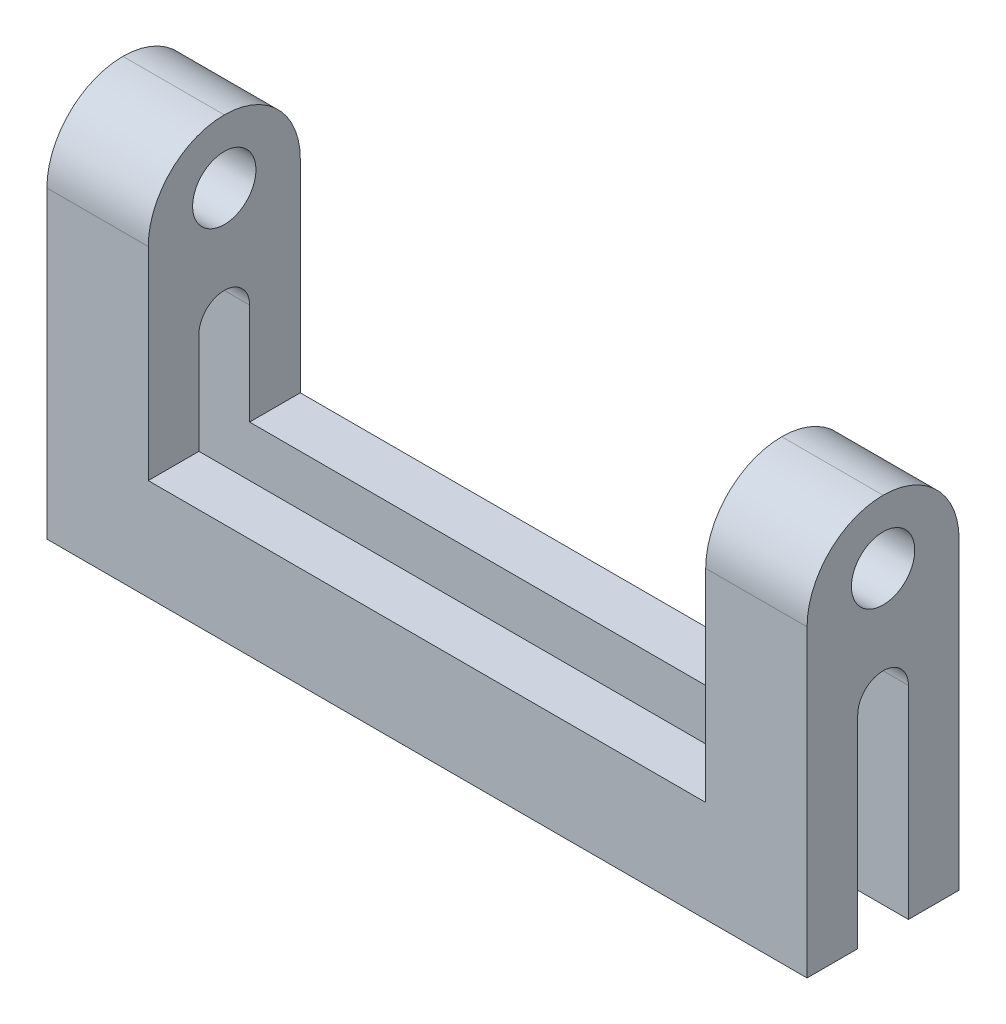
ISO-10303-21;
HEADER;
FILE_DESCRIPTION(('STEP AP214'),'2;1');
FILE_NAME('part.step','',(''),(''),'','','');
FILE_SCHEMA(('AUTOMOTIVE_DESIGN { 1 0 10303 214 1 1 1 1 }'));
ENDSEC;
DATA;
#1=APPLICATION_CONTEXT('core data for automotive mechanical design processes');
#2=APPLICATION_PROTOCOL_DEFINITION('international standard','automotive_design',2000,#1);
#3=PRODUCT_CONTEXT('',#1,'mechanical');
#4=PRODUCT('Part','Part','',(#3));
#5=PRODUCT_RELATED_PRODUCT_CATEGORY('part','',(#4));
#6=PRODUCT_DEFINITION_FORMATION('','',#4);
#7=PRODUCT_DEFINITION_CONTEXT('part definition',#1,'design');
#8=PRODUCT_DEFINITION('design','',#6,#7);
#9=PRODUCT_DEFINITION_SHAPE('','',#8);
#10=(LENGTH_UNIT() NAMED_UNIT(*) SI_UNIT(.MILLI.,.METRE.));
#11=(NAMED_UNIT(*) PLANE_ANGLE_UNIT() SI_UNIT($,.RADIAN.));
#12=(NAMED_UNIT(*) SI_UNIT($,.STERADIAN.) SOLID_ANGLE_UNIT());
#13=UNCERTAINTY_MEASURE_WITH_UNIT(LENGTH_MEASURE(1.E-05),#10,'distance_accuracy_value','');
#14=(GEOMETRIC_REPRESENTATION_CONTEXT(3) GLOBAL_UNCERTAINTY_ASSIGNED_CONTEXT((#13)) GLOBAL_UNIT_ASSIGNED_CONTEXT((#10,
#11,#12)) REPRESENTATION_CONTEXT('',''));
#15=CARTESIAN_POINT('',(0.,0.,0.));
#16=DIRECTION('',(0.,0.,1.));
#17=DIRECTION('',(1.,0.,0.));
#18=AXIS2_PLACEMENT_3D('',#15,#16,#17);
#19=CARTESIAN_POINT('',(0.,8.,0.));
#20=DIRECTION('',(0.,-1.,0.));
#21=DIRECTION('',(0.,0.,-1.));
#22=AXIS2_PLACEMENT_3D('',#19,#20,#21);
#23=PLANE('',#22);
#24=DIRECTION('',(0.,0.,-1.));
#25=VECTOR('',#24,1.);
#26=CARTESIAN_POINT('',(-22.,8.,-6.));
#27=LINE('',#26,#25);
#28=CARTESIAN_POINT('',(-22.,8.,-2.));
#29=VERTEX_POINT('',#28);
#30=CARTESIAN_POINT('',(-22.,8.,-6.));
#31=VERTEX_POINT('',#30);
#32=EDGE_CURVE('E376',#29,#31,#27,.T.);
#33=ORIENTED_EDGE('',*,*,#32,.F.);
#34=DIRECTION('',(1.,0.,0.));
#35=VECTOR('',#34,1.);
#36=CARTESIAN_POINT('',(0.,8.,-2.));
#37=LINE('',#36,#35);
#38=CARTESIAN_POINT('',(22.,8.,-2.));
#39=VERTEX_POINT('',#38);
#40=EDGE_CURVE('E429',#29,#39,#37,.T.);
#41=ORIENTED_EDGE('',*,*,#40,.T.);
#42=DIRECTION('',(0.,0.,1.));
#43=VECTOR('',#42,1.);
#44=CARTESIAN_POINT('',(22.,8.,-6.));
#45=LINE('',#44,#43);
#46=CARTESIAN_POINT('',(22.,8.,-6.));
#47=VERTEX_POINT('',#46);
#48=EDGE_CURVE('E362',#47,#39,#45,.T.);
#49=ORIENTED_EDGE('',*,*,#48,.F.);
#50=DIRECTION('',(-1.,0.,0.));
#51=VECTOR('',#50,1.);
#52=CARTESIAN_POINT('',(-30.,8.,-6.));
#53=LINE('',#52,#51);
#54=EDGE_CURVE('E222',#47,#31,#53,.T.);
#55=ORIENTED_EDGE('',*,*,#54,.T.);
#56=EDGE_LOOP('',(#33,#41,#49,#55));
#57=FACE_BOUND('',#56,.T.);
#58=ADVANCED_FACE('F39',(#57),#23,.F.);
#59=CARTESIAN_POINT('',(0.,0.,0.));
#60=DIRECTION('',(0.,-1.,0.));
#61=DIRECTION('',(0.,0.,-1.));
#62=AXIS2_PLACEMENT_3D('',#59,#60,#61);
#63=PLANE('',#62);
#64=DIRECTION('',(1.,0.,0.));
#65=VECTOR('',#64,1.);
#66=CARTESIAN_POINT('',(-30.,0.,-2.));
#67=LINE('',#66,#65);
#68=CARTESIAN_POINT('',(-30.,0.,-2.));
#69=VERTEX_POINT('',#68);
#70=CARTESIAN_POINT('',(30.,0.,-2.));
#71=VERTEX_POINT('',#70);
#72=EDGE_CURVE('E202',#69,#71,#67,.T.);
#73=ORIENTED_EDGE('',*,*,#72,.F.);
#74=DIRECTION('',(0.,0.,1.));
#75=VECTOR('',#74,1.);
#76=CARTESIAN_POINT('',(-30.,0.,6.));
#77=LINE('',#76,#75);
#78=CARTESIAN_POINT('',(-30.,0.,-6.));
#79=VERTEX_POINT('',#78);
#80=EDGE_CURVE('E210',#79,#69,#77,.T.);
#81=ORIENTED_EDGE('',*,*,#80,.F.);
#82=DIRECTION('',(-1.,0.,0.));
#83=VECTOR('',#82,1.);
#84=CARTESIAN_POINT('',(-30.,0.,-6.));
#85=LINE('',#84,#83);
#86=CARTESIAN_POINT('',(30.,0.,-6.));
#87=VERTEX_POINT('',#86);
#88=EDGE_CURVE('E211',#87,#79,#85,.T.);
#89=ORIENTED_EDGE('',*,*,#88,.F.);
#90=DIRECTION('',(0.,0.,-1.));
#91=VECTOR('',#90,1.);
#92=CARTESIAN_POINT('',(30.,0.,6.));
#93=LINE('',#92,#91);
#94=EDGE_CURVE('E387',#71,#87,#93,.T.);
#95=ORIENTED_EDGE('',*,*,#94,.F.);
#96=EDGE_LOOP('',(#73,#81,#89,#95));
#97=FACE_BOUND('',#96,.T.);
#98=ADVANCED_FACE('F409',(#97),#63,.T.);
#99=CARTESIAN_POINT('',(22.,8.,2.));
#100=VERTEX_POINT('',#99);
#101=CARTESIAN_POINT('',(22.,8.,6.));
#102=VERTEX_POINT('',#101);
#103=EDGE_CURVE('E356',#100,#102,#45,.T.);
#104=ORIENTED_EDGE('',*,*,#103,.F.);
#105=DIRECTION('',(-1.,0.,0.));
#106=VECTOR('',#105,1.);
#107=CARTESIAN_POINT('',(0.,8.,2.));
#108=LINE('',#107,#106);
#109=CARTESIAN_POINT('',(-22.,8.,2.));
#110=VERTEX_POINT('',#109);
#111=EDGE_CURVE('E345',#100,#110,#108,.T.);
#112=ORIENTED_EDGE('',*,*,#111,.T.);
#113=CARTESIAN_POINT('',(-22.,8.,6.));
#114=VERTEX_POINT('',#113);
#115=EDGE_CURVE('E377',#114,#110,#27,.T.);
#116=ORIENTED_EDGE('',*,*,#115,.F.);
#117=DIRECTION('',(1.,0.,0.));
#118=VECTOR('',#117,1.);
#119=CARTESIAN_POINT('',(-30.,8.,6.));
#120=LINE('',#119,#118);
#121=EDGE_CURVE('E227',#114,#102,#120,.T.);
#122=ORIENTED_EDGE('',*,*,#121,.T.);
#123=EDGE_LOOP('',(#104,#112,#116,#122));
#124=FACE_BOUND('',#123,.T.);
#125=ADVANCED_FACE('F357',(#124),#23,.F.);
#126=CARTESIAN_POINT('',(30.,8.,6.));
#127=DIRECTION('',(-1.,0.,0.));
#128=DIRECTION('',(0.,0.,1.));
#129=AXIS2_PLACEMENT_3D('',#126,#127,#128);
#130=PLANE('',#129);
#131=CARTESIAN_POINT('',(30.,25.,0.));
#132=DIRECTION('',(-1.,0.,0.));
#133=DIRECTION('',(0.,0.,1.));
#134=AXIS2_PLACEMENT_3D('',#131,#132,#133);
#135=CIRCLE('',#134,2.5);
#136=CARTESIAN_POINT('',(30.,25.,2.5));
#137=VERTEX_POINT('',#136);
#138=EDGE_CURVE('E243',#137,#137,#135,.T.);
#139=ORIENTED_EDGE('',*,*,#138,.T.);
#140=EDGE_LOOP('',(#139));
#141=FACE_BOUND('',#140,.T.);
#142=DIRECTION('',(0.,-1.,0.));
#143=VECTOR('',#142,1.);
#144=CARTESIAN_POINT('',(30.,18.,2.));
#145=LINE('',#144,#143);
#146=CARTESIAN_POINT('',(30.,16.,2.));
#147=VERTEX_POINT('',#146);
#148=CARTESIAN_POINT('',(30.,0.,2.));
#149=VERTEX_POINT('',#148);
#150=EDGE_CURVE('E193',#147,#149,#145,.T.);
#151=ORIENTED_EDGE('',*,*,#150,.F.);
#152=CARTESIAN_POINT('',(30.,16.,0.));
#153=DIRECTION('',(-1.,0.,0.));
#154=DIRECTION('',(0.,0.,1.));
#155=AXIS2_PLACEMENT_3D('',#152,#153,#154);
#156=CIRCLE('',#155,2.);
#157=CARTESIAN_POINT('',(30.,18.,0.));
#158=VERTEX_POINT('',#157);
#159=EDGE_CURVE('E11',#147,#158,#156,.T.);
#160=ORIENTED_EDGE('',*,*,#159,.T.);
#161=CARTESIAN_POINT('',(30.,16.,0.));
#162=DIRECTION('',(-1.,0.,0.));
#163=DIRECTION('',(0.,0.,1.));
#164=AXIS2_PLACEMENT_3D('',#161,#162,#163);
#165=CIRCLE('',#164,2.);
#166=CARTESIAN_POINT('',(30.,16.,-2.));
#167=VERTEX_POINT('',#166);
#168=EDGE_CURVE('E321',#158,#167,#165,.T.);
#169=ORIENTED_EDGE('',*,*,#168,.T.);
#170=DIRECTION('',(0.,-1.,0.));
#171=VECTOR('',#170,1.);
#172=CARTESIAN_POINT('',(30.,18.,-2.));
#173=LINE('',#172,#171);
#174=EDGE_CURVE('E353',#167,#71,#173,.T.);
#175=ORIENTED_EDGE('',*,*,#174,.T.);
#176=ORIENTED_EDGE('',*,*,#94,.T.);
#177=DIRECTION('',(0.,-1.,0.));
#178=VECTOR('',#177,1.);
#179=CARTESIAN_POINT('',(30.,8.,-6.));
#180=LINE('',#179,#178);
#181=CARTESIAN_POINT('',(30.,24.,-6.));
#182=VERTEX_POINT('',#181);
#183=EDGE_CURVE('E233',#182,#87,#180,.T.);
#184=ORIENTED_EDGE('',*,*,#183,.F.);
#185=CARTESIAN_POINT('',(30.,24.,0.));
#186=DIRECTION('',(-1.,0.,0.));
#187=DIRECTION('',(0.,0.,1.));
#188=AXIS2_PLACEMENT_3D('',#185,#186,#187);
#189=CIRCLE('',#188,6.);
#190=CARTESIAN_POINT('',(30.,30.,0.));
#191=VERTEX_POINT('',#190);
#192=EDGE_CURVE('E263',#182,#191,#189,.F.);
#193=ORIENTED_EDGE('',*,*,#192,.T.);
#194=CARTESIAN_POINT('',(30.,24.,0.));
#195=DIRECTION('',(-1.,0.,0.));
#196=DIRECTION('',(0.,0.,1.));
#197=AXIS2_PLACEMENT_3D('',#194,#195,#196);
#198=CIRCLE('',#197,6.);
#199=CARTESIAN_POINT('',(30.,24.,6.));
#200=VERTEX_POINT('',#199);
#201=EDGE_CURVE('E266',#191,#200,#198,.F.);
#202=ORIENTED_EDGE('',*,*,#201,.T.);
#203=DIRECTION('',(0.,-1.,0.));
#204=VECTOR('',#203,1.);
#205=CARTESIAN_POINT('',(30.,8.,6.));
#206=LINE('',#205,#204);
#207=CARTESIAN_POINT('',(30.,0.,6.));
#208=VERTEX_POINT('',#207);
#209=EDGE_CURVE('E223',#200,#208,#206,.T.);
#210=ORIENTED_EDGE('',*,*,#209,.T.);
#211=EDGE_CURVE('E216',#208,#149,#93,.T.);
#212=ORIENTED_EDGE('',*,*,#211,.T.);
#213=EDGE_LOOP('',(#151,#160,#169,#175,#176,#184,#193,#202,#210,#212));
#214=FACE_BOUND('',#213,.T.);
#215=ADVANCED_FACE('F396',(#141,#214),#130,.F.);
#216=CARTESIAN_POINT('',(-30.,8.,-6.));
#217=DIRECTION('',(0.,0.,1.));
#218=DIRECTION('',(1.,0.,0.));
#219=AXIS2_PLACEMENT_3D('',#216,#217,#218);
#220=PLANE('',#219);
#221=DIRECTION('',(0.,-1.,0.));
#222=VECTOR('',#221,1.);
#223=CARTESIAN_POINT('',(22.,30.,-6.));
#224=LINE('',#223,#222);
#225=CARTESIAN_POINT('',(22.,24.,-6.));
#226=VERTEX_POINT('',#225);
#227=EDGE_CURVE('E373',#226,#47,#224,.T.);
#228=ORIENTED_EDGE('',*,*,#227,.F.);
#229=DIRECTION('',(-1.,0.,0.));
#230=VECTOR('',#229,1.);
#231=CARTESIAN_POINT('',(-30.,24.,-6.));
#232=LINE('',#231,#230);
#233=EDGE_CURVE('E278',#226,#182,#232,.F.);
#234=ORIENTED_EDGE('',*,*,#233,.T.);
#235=ORIENTED_EDGE('',*,*,#183,.T.);
#236=ORIENTED_EDGE('',*,*,#88,.T.);
#237=DIRECTION('',(0.,-1.,0.));
#238=VECTOR('',#237,1.);
#239=CARTESIAN_POINT('',(-30.,8.,-6.));
#240=LINE('',#239,#238);
#241=CARTESIAN_POINT('',(-30.,24.,-6.));
#242=VERTEX_POINT('',#241);
#243=EDGE_CURVE('E230',#242,#79,#240,.T.);
#244=ORIENTED_EDGE('',*,*,#243,.F.);
#245=DIRECTION('',(-1.,0.,0.));
#246=VECTOR('',#245,1.);
#247=CARTESIAN_POINT('',(-22.,24.,-6.));
#248=LINE('',#247,#246);
#249=CARTESIAN_POINT('',(-22.,24.,-6.));
#250=VERTEX_POINT('',#249);
#251=EDGE_CURVE('E275',#242,#250,#248,.F.);
#252=ORIENTED_EDGE('',*,*,#251,.T.);
#253=DIRECTION('',(0.,-1.,0.));
#254=VECTOR('',#253,1.);
#255=CARTESIAN_POINT('',(-22.,30.,-6.));
#256=LINE('',#255,#254);
#257=EDGE_CURVE('E380',#250,#31,#256,.T.);
#258=ORIENTED_EDGE('',*,*,#257,.T.);
#259=ORIENTED_EDGE('',*,*,#54,.F.);
#260=EDGE_LOOP('',(#228,#234,#235,#236,#244,#252,#258,#259));
#261=FACE_BOUND('',#260,.T.);
#262=ADVANCED_FACE('F405',(#261),#220,.F.);
#263=CARTESIAN_POINT('',(-30.,8.,6.));
#264=DIRECTION('',(1.,0.,0.));
#265=DIRECTION('',(0.,0.,-1.));
#266=AXIS2_PLACEMENT_3D('',#263,#264,#265);
#267=PLANE('',#266);
#268=ORIENTED_EDGE('',*,*,#80,.T.);
#269=DIRECTION('',(0.,-1.,0.));
#270=VECTOR('',#269,1.);
#271=CARTESIAN_POINT('',(-30.,18.,-2.));
#272=LINE('',#271,#270);
#273=CARTESIAN_POINT('',(-30.,16.,-2.));
#274=VERTEX_POINT('',#273);
#275=EDGE_CURVE('E192',#274,#69,#272,.T.);
#276=ORIENTED_EDGE('',*,*,#275,.F.);
#277=CARTESIAN_POINT('',(-30.,16.,0.));
#278=DIRECTION('',(1.,0.,0.));
#279=DIRECTION('',(0.,0.,-1.));
#280=AXIS2_PLACEMENT_3D('',#277,#278,#279);
#281=CIRCLE('',#280,2.);
#282=CARTESIAN_POINT('',(-30.,18.,0.));
#283=VERTEX_POINT('',#282);
#284=EDGE_CURVE('E318',#274,#283,#281,.T.);
#285=ORIENTED_EDGE('',*,*,#284,.T.);
#286=CARTESIAN_POINT('',(-30.,16.,0.));
#287=DIRECTION('',(1.,0.,0.));
#288=DIRECTION('',(0.,0.,-1.));
#289=AXIS2_PLACEMENT_3D('',#286,#287,#288);
#290=CIRCLE('',#289,2.);
#291=CARTESIAN_POINT('',(-30.,16.,2.));
#292=VERTEX_POINT('',#291);
#293=EDGE_CURVE('E187',#283,#292,#290,.T.);
#294=ORIENTED_EDGE('',*,*,#293,.T.);
#295=DIRECTION('',(0.,-1.,0.));
#296=VECTOR('',#295,1.);
#297=CARTESIAN_POINT('',(-30.,18.,2.));
#298=LINE('',#297,#296);
#299=CARTESIAN_POINT('',(-30.,0.,2.));
#300=VERTEX_POINT('',#299);
#301=EDGE_CURVE('E177',#292,#300,#298,.T.);
#302=ORIENTED_EDGE('',*,*,#301,.T.);
#303=CARTESIAN_POINT('',(-30.,0.,6.));
#304=VERTEX_POINT('',#303);
#305=EDGE_CURVE('E184',#300,#304,#77,.T.);
#306=ORIENTED_EDGE('',*,*,#305,.T.);
#307=DIRECTION('',(0.,-1.,0.));
#308=VECTOR('',#307,1.);
#309=CARTESIAN_POINT('',(-30.,8.,6.));
#310=LINE('',#309,#308);
#311=CARTESIAN_POINT('',(-30.,24.,6.));
#312=VERTEX_POINT('',#311);
#313=EDGE_CURVE('E226',#312,#304,#310,.T.);
#314=ORIENTED_EDGE('',*,*,#313,.F.);
#315=CARTESIAN_POINT('',(-30.,24.,0.));
#316=DIRECTION('',(1.,0.,0.));
#317=DIRECTION('',(0.,0.,-1.));
#318=AXIS2_PLACEMENT_3D('',#315,#316,#317);
#319=CIRCLE('',#318,6.);
#320=CARTESIAN_POINT('',(-30.,30.,0.));
#321=VERTEX_POINT('',#320);
#322=EDGE_CURVE('E260',#312,#321,#319,.F.);
#323=ORIENTED_EDGE('',*,*,#322,.T.);
#324=CARTESIAN_POINT('',(-30.,24.,0.));
#325=DIRECTION('',(1.,0.,0.));
#326=DIRECTION('',(0.,0.,-1.));
#327=AXIS2_PLACEMENT_3D('',#324,#325,#326);
#328=CIRCLE('',#327,6.);
#329=EDGE_CURVE('E257',#321,#242,#328,.F.);
#330=ORIENTED_EDGE('',*,*,#329,.T.);
#331=ORIENTED_EDGE('',*,*,#243,.T.);
#332=EDGE_LOOP('',(#268,#276,#285,#294,#302,#306,#314,#323,#330,#331));
#333=FACE_BOUND('',#332,.T.);
#334=CARTESIAN_POINT('',(-30.,25.,0.));
#335=DIRECTION('',(-1.,0.,0.));
#336=DIRECTION('',(0.,0.,1.));
#337=AXIS2_PLACEMENT_3D('',#334,#335,#336);
#338=CIRCLE('',#337,2.5);
#339=CARTESIAN_POINT('',(-30.,25.,2.5));
#340=VERTEX_POINT('',#339);
#341=EDGE_CURVE('E286',#340,#340,#338,.T.);
#342=ORIENTED_EDGE('',*,*,#341,.F.);
#343=EDGE_LOOP('',(#342));
#344=FACE_BOUND('',#343,.T.);
#345=ADVANCED_FACE('F180',(#333,#344),#267,.F.);
#346=CARTESIAN_POINT('',(-30.,8.,6.));
#347=DIRECTION('',(0.,0.,-1.));
#348=DIRECTION('',(-1.,0.,0.));
#349=AXIS2_PLACEMENT_3D('',#346,#347,#348);
#350=PLANE('',#349);
#351=DIRECTION('',(0.,-1.,0.));
#352=VECTOR('',#351,1.);
#353=CARTESIAN_POINT('',(-22.,30.,6.));
#354=LINE('',#353,#352);
#355=CARTESIAN_POINT('',(-22.,24.,6.));
#356=VERTEX_POINT('',#355);
#357=EDGE_CURVE('E384',#356,#114,#354,.T.);
#358=ORIENTED_EDGE('',*,*,#357,.F.);
#359=DIRECTION('',(1.,0.,0.));
#360=VECTOR('',#359,1.);
#361=CARTESIAN_POINT('',(-30.,24.,6.));
#362=LINE('',#361,#360);
#363=EDGE_CURVE('E253',#356,#312,#362,.F.);
#364=ORIENTED_EDGE('',*,*,#363,.T.);
#365=ORIENTED_EDGE('',*,*,#313,.T.);
#366=DIRECTION('',(1.,0.,0.));
#367=VECTOR('',#366,1.);
#368=CARTESIAN_POINT('',(-30.,0.,6.));
#369=LINE('',#368,#367);
#370=EDGE_CURVE('E208',#304,#208,#369,.T.);
#371=ORIENTED_EDGE('',*,*,#370,.T.);
#372=ORIENTED_EDGE('',*,*,#209,.F.);
#373=DIRECTION('',(1.,0.,0.));
#374=VECTOR('',#373,1.);
#375=CARTESIAN_POINT('',(-30.,24.,6.));
#376=LINE('',#375,#374);
#377=CARTESIAN_POINT('',(22.,24.,6.));
#378=VERTEX_POINT('',#377);
#379=EDGE_CURVE('E249',#200,#378,#376,.F.);
#380=ORIENTED_EDGE('',*,*,#379,.T.);
#381=DIRECTION('',(0.,-1.,0.));
#382=VECTOR('',#381,1.);
#383=CARTESIAN_POINT('',(22.,30.,6.));
#384=LINE('',#383,#382);
#385=EDGE_CURVE('E366',#378,#102,#384,.T.);
#386=ORIENTED_EDGE('',*,*,#385,.T.);
#387=ORIENTED_EDGE('',*,*,#121,.F.);
#388=EDGE_LOOP('',(#358,#364,#365,#371,#372,#380,#386,#387));
#389=FACE_BOUND('',#388,.T.);
#390=ADVANCED_FACE('F439',(#389),#350,.F.);
#391=DIRECTION('',(-1.,0.,0.));
#392=VECTOR('',#391,1.);
#393=CARTESIAN_POINT('',(-30.,0.,2.));
#394=LINE('',#393,#392);
#395=EDGE_CURVE('E196',#149,#300,#394,.T.);
#396=ORIENTED_EDGE('',*,*,#395,.F.);
#397=ORIENTED_EDGE('',*,*,#211,.F.);
#398=ORIENTED_EDGE('',*,*,#370,.F.);
#399=ORIENTED_EDGE('',*,*,#305,.F.);
#400=EDGE_LOOP('',(#396,#397,#398,#399));
#401=FACE_BOUND('',#400,.T.);
#402=ADVANCED_FACE('F206',(#401),#63,.T.);
#403=CARTESIAN_POINT('',(-22.,30.,-6.));
#404=DIRECTION('',(-1.,0.,0.));
#405=DIRECTION('',(0.,0.,1.));
#406=AXIS2_PLACEMENT_3D('',#403,#404,#405);
#407=PLANE('',#406);
#408=CARTESIAN_POINT('',(-22.,25.,0.));
#409=DIRECTION('',(-1.,0.,0.));
#410=DIRECTION('',(0.,0.,1.));
#411=AXIS2_PLACEMENT_3D('',#408,#409,#410);
#412=CIRCLE('',#411,2.5);
#413=CARTESIAN_POINT('',(-22.,25.,2.5));
#414=VERTEX_POINT('',#413);
#415=EDGE_CURVE('E242',#414,#414,#412,.T.);
#416=ORIENTED_EDGE('',*,*,#415,.T.);
#417=EDGE_LOOP('',(#416));
#418=FACE_BOUND('',#417,.T.);
#419=CARTESIAN_POINT('',(-22.,16.,0.));
#420=DIRECTION('',(-1.,0.,0.));
#421=DIRECTION('',(0.,0.,1.));
#422=AXIS2_PLACEMENT_3D('',#419,#420,#421);
#423=CIRCLE('',#422,2.);
#424=CARTESIAN_POINT('',(-22.,16.,2.));
#425=VERTEX_POINT('',#424);
#426=CARTESIAN_POINT('',(-22.,18.,0.));
#427=VERTEX_POINT('',#426);
#428=EDGE_CURVE('E312',#425,#427,#423,.T.);
#429=ORIENTED_EDGE('',*,*,#428,.T.);
#430=CARTESIAN_POINT('',(-22.,16.,0.));
#431=DIRECTION('',(-1.,0.,0.));
#432=DIRECTION('',(0.,0.,1.));
#433=AXIS2_PLACEMENT_3D('',#430,#431,#432);
#434=CIRCLE('',#433,2.);
#435=CARTESIAN_POINT('',(-22.,16.,-2.));
#436=VERTEX_POINT('',#435);
#437=EDGE_CURVE('E315',#427,#436,#434,.T.);
#438=ORIENTED_EDGE('',*,*,#437,.T.);
#439=DIRECTION('',(0.,-1.,0.));
#440=VECTOR('',#439,1.);
#441=CARTESIAN_POINT('',(-22.,30.,-2.));
#442=LINE('',#441,#440);
#443=EDGE_CURVE('E291',#436,#29,#442,.T.);
#444=ORIENTED_EDGE('',*,*,#443,.T.);
#445=ORIENTED_EDGE('',*,*,#32,.T.);
#446=ORIENTED_EDGE('',*,*,#257,.F.);
#447=CARTESIAN_POINT('',(-22.,24.,0.));
#448=DIRECTION('',(-1.,0.,0.));
#449=DIRECTION('',(0.,0.,1.));
#450=AXIS2_PLACEMENT_3D('',#447,#448,#449);
#451=CIRCLE('',#450,6.);
#452=CARTESIAN_POINT('',(-22.,30.,0.));
#453=VERTEX_POINT('',#452);
#454=EDGE_CURVE('E237',#250,#453,#451,.F.);
#455=ORIENTED_EDGE('',*,*,#454,.T.);
#456=CARTESIAN_POINT('',(-22.,24.,0.));
#457=DIRECTION('',(-1.,0.,0.));
#458=DIRECTION('',(0.,0.,1.));
#459=AXIS2_PLACEMENT_3D('',#456,#457,#458);
#460=CIRCLE('',#459,6.);
#461=EDGE_CURVE('E246',#453,#356,#460,.F.);
#462=ORIENTED_EDGE('',*,*,#461,.T.);
#463=ORIENTED_EDGE('',*,*,#357,.T.);
#464=ORIENTED_EDGE('',*,*,#115,.T.);
#465=DIRECTION('',(0.,1.,0.));
#466=VECTOR('',#465,1.);
#467=CARTESIAN_POINT('',(-22.,30.,2.));
#468=LINE('',#467,#466);
#469=EDGE_CURVE('E348',#110,#425,#468,.T.);
#470=ORIENTED_EDGE('',*,*,#469,.T.);
#471=EDGE_LOOP('',(#429,#438,#444,#445,#446,#455,#462,#463,#464,#470));
#472=FACE_BOUND('',#471,.T.);
#473=ADVANCED_FACE('F421',(#418,#472),#407,.F.);
#474=CARTESIAN_POINT('',(22.,30.,-6.));
#475=DIRECTION('',(1.,0.,0.));
#476=DIRECTION('',(0.,0.,-1.));
#477=AXIS2_PLACEMENT_3D('',#474,#475,#476);
#478=PLANE('',#477);
#479=ORIENTED_EDGE('',*,*,#48,.T.);
#480=DIRECTION('',(0.,1.,0.));
#481=VECTOR('',#480,1.);
#482=CARTESIAN_POINT('',(22.,30.,-2.));
#483=LINE('',#482,#481);
#484=CARTESIAN_POINT('',(22.,16.,-2.));
#485=VERTEX_POINT('',#484);
#486=EDGE_CURVE('E294',#39,#485,#483,.T.);
#487=ORIENTED_EDGE('',*,*,#486,.T.);
#488=CARTESIAN_POINT('',(22.,16.,0.));
#489=DIRECTION('',(1.,0.,0.));
#490=DIRECTION('',(0.,0.,-1.));
#491=AXIS2_PLACEMENT_3D('',#488,#489,#490);
#492=CIRCLE('',#491,2.);
#493=CARTESIAN_POINT('',(22.,18.,0.));
#494=VERTEX_POINT('',#493);
#495=EDGE_CURVE('E57',#485,#494,#492,.T.);
#496=ORIENTED_EDGE('',*,*,#495,.T.);
#497=CARTESIAN_POINT('',(22.,16.,0.));
#498=DIRECTION('',(1.,0.,0.));
#499=DIRECTION('',(0.,0.,-1.));
#500=AXIS2_PLACEMENT_3D('',#497,#498,#499);
#501=CIRCLE('',#500,2.);
#502=CARTESIAN_POINT('',(22.,16.,2.));
#503=VERTEX_POINT('',#502);
#504=EDGE_CURVE('E49',#494,#503,#501,.T.);
#505=ORIENTED_EDGE('',*,*,#504,.T.);
#506=DIRECTION('',(0.,-1.,0.));
#507=VECTOR('',#506,1.);
#508=CARTESIAN_POINT('',(22.,30.,2.));
#509=LINE('',#508,#507);
#510=EDGE_CURVE('E281',#503,#100,#509,.T.);
#511=ORIENTED_EDGE('',*,*,#510,.T.);
#512=ORIENTED_EDGE('',*,*,#103,.T.);
#513=ORIENTED_EDGE('',*,*,#385,.F.);
#514=CARTESIAN_POINT('',(22.,24.,0.));
#515=DIRECTION('',(1.,0.,0.));
#516=DIRECTION('',(0.,0.,-1.));
#517=AXIS2_PLACEMENT_3D('',#514,#515,#516);
#518=CIRCLE('',#517,6.);
#519=CARTESIAN_POINT('',(22.,30.,0.));
#520=VERTEX_POINT('',#519);
#521=EDGE_CURVE('E272',#378,#520,#518,.F.);
#522=ORIENTED_EDGE('',*,*,#521,.T.);
#523=CARTESIAN_POINT('',(22.,24.,0.));
#524=DIRECTION('',(1.,0.,0.));
#525=DIRECTION('',(0.,0.,-1.));
#526=AXIS2_PLACEMENT_3D('',#523,#524,#525);
#527=CIRCLE('',#526,6.);
#528=EDGE_CURVE('E269',#520,#226,#527,.F.);
#529=ORIENTED_EDGE('',*,*,#528,.T.);
#530=ORIENTED_EDGE('',*,*,#227,.T.);
#531=EDGE_LOOP('',(#479,#487,#496,#505,#511,#512,#513,#522,#529,#530));
#532=FACE_BOUND('',#531,.T.);
#533=CARTESIAN_POINT('',(22.,25.,0.));
#534=DIRECTION('',(1.,0.,0.));
#535=DIRECTION('',(0.,0.,-1.));
#536=AXIS2_PLACEMENT_3D('',#533,#534,#535);
#537=CIRCLE('',#536,2.5);
#538=CARTESIAN_POINT('',(22.,25.,2.5));
#539=VERTEX_POINT('',#538);
#540=EDGE_CURVE('E238',#539,#539,#537,.T.);
#541=ORIENTED_EDGE('',*,*,#540,.T.);
#542=EDGE_LOOP('',(#541));
#543=FACE_BOUND('',#542,.T.);
#544=ADVANCED_FACE('F341',(#532,#543),#478,.F.);
#545=CARTESIAN_POINT('',(30.,25.,0.));
#546=DIRECTION('',(-1.,0.,0.));
#547=DIRECTION('',(0.,0.,1.));
#548=AXIS2_PLACEMENT_3D('',#545,#546,#547);
#549=CYLINDRICAL_SURFACE('',#548,2.5);
#550=CARTESIAN_POINT('',(30.,25.,2.5));
#551=CARTESIAN_POINT('',(29.9166666666667,25.,2.5));
#552=CARTESIAN_POINT('',(29.8333333333333,25.,2.5));
#553=CARTESIAN_POINT('',(29.6666666666667,25.,2.5));
#554=CARTESIAN_POINT('',(29.5833333333333,25.,2.5));
#555=CARTESIAN_POINT('',(29.4166666666667,25.,2.5));
#556=CARTESIAN_POINT('',(29.3333333333333,25.,2.5));
#557=CARTESIAN_POINT('',(29.1666666666667,25.,2.5));
#558=CARTESIAN_POINT('',(29.0833333333333,25.,2.5));
#559=CARTESIAN_POINT('',(28.9166666666667,25.,2.5));
#560=CARTESIAN_POINT('',(28.8333333333333,25.,2.5));
#561=CARTESIAN_POINT('',(28.6666666666667,25.,2.5));
#562=CARTESIAN_POINT('',(28.5833333333333,25.,2.5));
#563=CARTESIAN_POINT('',(28.4166666666667,25.,2.5));
#564=CARTESIAN_POINT('',(28.3333333333333,25.,2.5));
#565=CARTESIAN_POINT('',(28.1666666666667,25.,2.5));
#566=CARTESIAN_POINT('',(28.0833333333333,25.,2.5));
#567=CARTESIAN_POINT('',(27.9166666666667,25.,2.5));
#568=CARTESIAN_POINT('',(27.8333333333333,25.,2.5));
#569=CARTESIAN_POINT('',(27.6666666666667,25.,2.5));
#570=CARTESIAN_POINT('',(27.5833333333333,25.,2.5));
#571=CARTESIAN_POINT('',(27.4166666666667,25.,2.5));
#572=CARTESIAN_POINT('',(27.3333333333333,25.,2.5));
#573=CARTESIAN_POINT('',(27.1666666666667,25.,2.5));
#574=CARTESIAN_POINT('',(27.0833333333333,25.,2.5));
#575=CARTESIAN_POINT('',(26.9166666666667,25.,2.5));
#576=CARTESIAN_POINT('',(26.8333333333333,25.,2.5));
#577=CARTESIAN_POINT('',(26.6666666666667,25.,2.5));
#578=CARTESIAN_POINT('',(26.5833333333333,25.,2.5));
#579=CARTESIAN_POINT('',(26.4166666666667,25.,2.5));
#580=CARTESIAN_POINT('',(26.3333333333333,25.,2.5));
#581=CARTESIAN_POINT('',(26.1666666666667,25.,2.5));
#582=CARTESIAN_POINT('',(26.0833333333333,25.,2.5));
#583=CARTESIAN_POINT('',(25.9166666666667,25.,2.5));
#584=CARTESIAN_POINT('',(25.8333333333333,25.,2.5));
#585=CARTESIAN_POINT('',(25.6666666666667,25.,2.5));
#586=CARTESIAN_POINT('',(25.5833333333333,25.,2.5));
#587=CARTESIAN_POINT('',(25.4166666666667,25.,2.5));
#588=CARTESIAN_POINT('',(25.3333333333333,25.,2.5));
#589=CARTESIAN_POINT('',(25.1666666666667,25.,2.5));
#590=CARTESIAN_POINT('',(25.0833333333333,25.,2.5));
#591=CARTESIAN_POINT('',(24.9166666666667,25.,2.5));
#592=CARTESIAN_POINT('',(24.8333333333333,25.,2.5));
#593=CARTESIAN_POINT('',(24.6666666666667,25.,2.5));
#594=CARTESIAN_POINT('',(24.5833333333333,25.,2.5));
#595=CARTESIAN_POINT('',(24.4166666666667,25.,2.5));
#596=CARTESIAN_POINT('',(24.3333333333333,25.,2.5));
#597=CARTESIAN_POINT('',(24.1666666666667,25.,2.5));
#598=CARTESIAN_POINT('',(24.0833333333333,25.,2.5));
#599=CARTESIAN_POINT('',(23.9166666666667,25.,2.5));
#600=CARTESIAN_POINT('',(23.8333333333333,25.,2.5));
#601=CARTESIAN_POINT('',(23.6666666666667,25.,2.5));
#602=CARTESIAN_POINT('',(23.5833333333333,25.,2.5));
#603=CARTESIAN_POINT('',(23.4166666666667,25.,2.5));
#604=CARTESIAN_POINT('',(23.3333333333333,25.,2.5));
#605=CARTESIAN_POINT('',(23.1666666666667,25.,2.5));
#606=CARTESIAN_POINT('',(23.0833333333333,25.,2.5));
#607=CARTESIAN_POINT('',(22.9166666666667,25.,2.5));
#608=CARTESIAN_POINT('',(22.8333333333333,25.,2.5));
#609=CARTESIAN_POINT('',(22.6666666666667,25.,2.5));
#610=CARTESIAN_POINT('',(22.5833333333333,25.,2.5));
#611=CARTESIAN_POINT('',(22.4166666666667,25.,2.5));
#612=CARTESIAN_POINT('',(22.3333333333333,25.,2.5));
#613=CARTESIAN_POINT('',(22.1666666666667,25.,2.5));
#614=CARTESIAN_POINT('',(22.0833333333333,25.,2.5));
#615=CARTESIAN_POINT('',(22.,25.,2.5));
#616=B_SPLINE_CURVE_WITH_KNOTS('',3,(#550,#551,#552,#553,#554,#555,#556,#557,#558,#559,#560,
#561,#562,#563,#564,#565,#566,#567,#568,#569,#570,#571,#572,#573,#574,#575,#576,#577,#578,#579,
#580,#581,#582,#583,#584,#585,#586,#587,#588,#589,#590,#591,#592,#593,#594,#595,#596,#597,#598,
#599,#600,#601,#602,#603,#604,#605,#606,#607,#608,#609,#610,#611,#612,#613,#614,#615),
.UNSPECIFIED.,.F.,.F.,(4,2,2,2,2,2,2,2,2,2,2,2,2,2,2,2,2,2,2,2,2,2,2,2,2,2,2,2,2,2,2,2,4),(0.,
0.249999999999997,0.499999999999997,0.749999999999997,0.999999999999997,1.25,1.5,1.75,2.,2.25,
2.5,2.75,3.,3.25,3.5,3.75,4.,4.25,4.5,4.75,5.,5.25,5.5,5.75,6.,6.25,6.5,6.75,7.,7.25,7.5,7.75,
8.),.UNSPECIFIED.);
#617=EDGE_CURVE('BSEAM483',#137,#539,#616,.T.);
#618=ORIENTED_EDGE('',*,*,#138,.F.);
#619=ORIENTED_EDGE('',*,*,#540,.F.);
#620=ORIENTED_EDGE('',*,*,#617,.T.);
#621=ORIENTED_EDGE('',*,*,#617,.F.);
#622=EDGE_LOOP('',(#618,#620,#619,#621));
#623=FACE_BOUND('',#622,.T.);
#624=ADVANCED_FACE('F483',(#623),#549,.F.);
#625=CARTESIAN_POINT('',(-30.,25.,2.5));
#626=CARTESIAN_POINT('',(-29.9166666666667,25.,2.5));
#627=CARTESIAN_POINT('',(-29.8333333333333,25.,2.5));
#628=CARTESIAN_POINT('',(-29.6666666666667,25.,2.5));
#629=CARTESIAN_POINT('',(-29.5833333333333,25.,2.5));
#630=CARTESIAN_POINT('',(-29.4166666666667,25.,2.5));
#631=CARTESIAN_POINT('',(-29.3333333333333,25.,2.5));
#632=CARTESIAN_POINT('',(-29.1666666666667,25.,2.5));
#633=CARTESIAN_POINT('',(-29.0833333333333,25.,2.5));
#634=CARTESIAN_POINT('',(-28.9166666666667,25.,2.5));
#635=CARTESIAN_POINT('',(-28.8333333333333,25.,2.5));
#636=CARTESIAN_POINT('',(-28.6666666666667,25.,2.5));
#637=CARTESIAN_POINT('',(-28.5833333333333,25.,2.5));
#638=CARTESIAN_POINT('',(-28.4166666666667,25.,2.5));
#639=CARTESIAN_POINT('',(-28.3333333333333,25.,2.5));
#640=CARTESIAN_POINT('',(-28.1666666666667,25.,2.5));
#641=CARTESIAN_POINT('',(-28.0833333333333,25.,2.5));
#642=CARTESIAN_POINT('',(-27.9166666666667,25.,2.5));
#643=CARTESIAN_POINT('',(-27.8333333333333,25.,2.5));
#644=CARTESIAN_POINT('',(-27.6666666666667,25.,2.5));
#645=CARTESIAN_POINT('',(-27.5833333333333,25.,2.5));
#646=CARTESIAN_POINT('',(-27.4166666666667,25.,2.5));
#647=CARTESIAN_POINT('',(-27.3333333333333,25.,2.5));
#648=CARTESIAN_POINT('',(-27.1666666666667,25.,2.5));
#649=CARTESIAN_POINT('',(-27.0833333333333,25.,2.5));
#650=CARTESIAN_POINT('',(-26.9166666666667,25.,2.5));
#651=CARTESIAN_POINT('',(-26.8333333333333,25.,2.5));
#652=CARTESIAN_POINT('',(-26.6666666666667,25.,2.5));
#653=CARTESIAN_POINT('',(-26.5833333333333,25.,2.5));
#654=CARTESIAN_POINT('',(-26.4166666666667,25.,2.5));
#655=CARTESIAN_POINT('',(-26.3333333333333,25.,2.5));
#656=CARTESIAN_POINT('',(-26.1666666666667,25.,2.5));
#657=CARTESIAN_POINT('',(-26.0833333333333,25.,2.5));
#658=CARTESIAN_POINT('',(-25.9166666666667,25.,2.5));
#659=CARTESIAN_POINT('',(-25.8333333333333,25.,2.5));
#660=CARTESIAN_POINT('',(-25.6666666666667,25.,2.5));
#661=CARTESIAN_POINT('',(-25.5833333333333,25.,2.5));
#662=CARTESIAN_POINT('',(-25.4166666666667,25.,2.5));
#663=CARTESIAN_POINT('',(-25.3333333333333,25.,2.5));
#664=CARTESIAN_POINT('',(-25.1666666666667,25.,2.5));
#665=CARTESIAN_POINT('',(-25.0833333333333,25.,2.5));
#666=CARTESIAN_POINT('',(-24.9166666666667,25.,2.5));
#667=CARTESIAN_POINT('',(-24.8333333333333,25.,2.5));
#668=CARTESIAN_POINT('',(-24.6666666666667,25.,2.5));
#669=CARTESIAN_POINT('',(-24.5833333333333,25.,2.5));
#670=CARTESIAN_POINT('',(-24.4166666666667,25.,2.5));
#671=CARTESIAN_POINT('',(-24.3333333333333,25.,2.5));
#672=CARTESIAN_POINT('',(-24.1666666666667,25.,2.5));
#673=CARTESIAN_POINT('',(-24.0833333333333,25.,2.5));
#674=CARTESIAN_POINT('',(-23.9166666666667,25.,2.5));
#675=CARTESIAN_POINT('',(-23.8333333333333,25.,2.5));
#676=CARTESIAN_POINT('',(-23.6666666666667,25.,2.5));
#677=CARTESIAN_POINT('',(-23.5833333333333,25.,2.5));
#678=CARTESIAN_POINT('',(-23.4166666666667,25.,2.5));
#679=CARTESIAN_POINT('',(-23.3333333333333,25.,2.5));
#680=CARTESIAN_POINT('',(-23.1666666666667,25.,2.5));
#681=CARTESIAN_POINT('',(-23.0833333333333,25.,2.5));
#682=CARTESIAN_POINT('',(-22.9166666666667,25.,2.5));
#683=CARTESIAN_POINT('',(-22.8333333333333,25.,2.5));
#684=CARTESIAN_POINT('',(-22.6666666666667,25.,2.5));
#685=CARTESIAN_POINT('',(-22.5833333333333,25.,2.5));
#686=CARTESIAN_POINT('',(-22.4166666666667,25.,2.5));
#687=CARTESIAN_POINT('',(-22.3333333333333,25.,2.5));
#688=CARTESIAN_POINT('',(-22.1666666666667,25.,2.5));
#689=CARTESIAN_POINT('',(-22.0833333333333,25.,2.5));
#690=CARTESIAN_POINT('',(-22.,25.,2.5));
#691=B_SPLINE_CURVE_WITH_KNOTS('',3,(#625,#626,#627,#628,#629,#630,#631,#632,#633,#634,#635,
#636,#637,#638,#639,#640,#641,#642,#643,#644,#645,#646,#647,#648,#649,#650,#651,#652,#653,#654,
#655,#656,#657,#658,#659,#660,#661,#662,#663,#664,#665,#666,#667,#668,#669,#670,#671,#672,#673,
#674,#675,#676,#677,#678,#679,#680,#681,#682,#683,#684,#685,#686,#687,#688,#689,#690),
.UNSPECIFIED.,.F.,.F.,(4,2,2,2,2,2,2,2,2,2,2,2,2,2,2,2,2,2,2,2,2,2,2,2,2,2,2,2,2,2,2,2,4),(0.,
0.25,0.5,0.750000000000001,1.,1.25,1.5,1.75,2.,2.25,2.5,2.75,3.,3.25,3.5,3.75,4.,4.25,4.5,4.75,
5.,5.25,5.50000000000001,5.75000000000001,6.00000000000001,6.25000000000001,6.50000000000001,
6.75000000000001,7.00000000000001,7.25000000000001,7.50000000000001,7.75000000000001,
8.00000000000001),.UNSPECIFIED.);
#692=EDGE_CURVE('BSEAM451',#340,#414,#691,.T.);
#693=ORIENTED_EDGE('',*,*,#341,.T.);
#694=ORIENTED_EDGE('',*,*,#415,.F.);
#695=ORIENTED_EDGE('',*,*,#692,.T.);
#696=ORIENTED_EDGE('',*,*,#692,.F.);
#697=EDGE_LOOP('',(#693,#695,#694,#696));
#698=FACE_BOUND('',#697,.T.);
#699=ADVANCED_FACE('F451',(#698),#549,.F.);
#700=CARTESIAN_POINT('',(0.,24.,0.));
#701=DIRECTION('',(1.,0.,0.));
#702=DIRECTION('',(0.,0.,-1.));
#703=AXIS2_PLACEMENT_3D('',#700,#701,#702);
#704=CYLINDRICAL_SURFACE('',#703,6.);
#705=ORIENTED_EDGE('',*,*,#251,.F.);
#706=ORIENTED_EDGE('',*,*,#329,.F.);
#707=DIRECTION('',(-1.,0.,0.));
#708=VECTOR('',#707,1.);
#709=CARTESIAN_POINT('',(-30.,30.,0.));
#710=LINE('',#709,#708);
#711=EDGE_CURVE('E282',#453,#321,#710,.T.);
#712=ORIENTED_EDGE('',*,*,#711,.F.);
#713=ORIENTED_EDGE('',*,*,#454,.F.);
#714=EDGE_LOOP('',(#705,#706,#712,#713));
#715=FACE_BOUND('',#714,.T.);
#716=ADVANCED_FACE('F417',(#715),#704,.T.);
#717=CARTESIAN_POINT('',(0.,24.,0.));
#718=DIRECTION('',(-1.,0.,0.));
#719=DIRECTION('',(0.,0.,1.));
#720=AXIS2_PLACEMENT_3D('',#717,#718,#719);
#721=CYLINDRICAL_SURFACE('',#720,6.);
#722=ORIENTED_EDGE('',*,*,#322,.F.);
#723=ORIENTED_EDGE('',*,*,#363,.F.);
#724=ORIENTED_EDGE('',*,*,#461,.F.);
#725=ORIENTED_EDGE('',*,*,#711,.T.);
#726=EDGE_LOOP('',(#722,#723,#724,#725));
#727=FACE_BOUND('',#726,.T.);
#728=ADVANCED_FACE('F443',(#727),#721,.T.);
#729=CARTESIAN_POINT('',(0.,24.,0.));
#730=DIRECTION('',(-1.,0.,0.));
#731=DIRECTION('',(0.,0.,1.));
#732=AXIS2_PLACEMENT_3D('',#729,#730,#731);
#733=CYLINDRICAL_SURFACE('',#732,6.);
#734=ORIENTED_EDGE('',*,*,#233,.F.);
#735=ORIENTED_EDGE('',*,*,#528,.F.);
#736=DIRECTION('',(-1.,0.,0.));
#737=VECTOR('',#736,1.);
#738=CARTESIAN_POINT('',(0.,30.,0.));
#739=LINE('',#738,#737);
#740=EDGE_CURVE('E287',#191,#520,#739,.T.);
#741=ORIENTED_EDGE('',*,*,#740,.F.);
#742=ORIENTED_EDGE('',*,*,#192,.F.);
#743=EDGE_LOOP('',(#734,#735,#741,#742));
#744=FACE_BOUND('',#743,.T.);
#745=ADVANCED_FACE('F432',(#744),#733,.T.);
#746=CARTESIAN_POINT('',(0.,24.,0.));
#747=DIRECTION('',(1.,0.,0.));
#748=DIRECTION('',(0.,0.,-1.));
#749=AXIS2_PLACEMENT_3D('',#746,#747,#748);
#750=CYLINDRICAL_SURFACE('',#749,6.);
#751=ORIENTED_EDGE('',*,*,#521,.F.);
#752=ORIENTED_EDGE('',*,*,#379,.F.);
#753=ORIENTED_EDGE('',*,*,#201,.F.);
#754=ORIENTED_EDGE('',*,*,#740,.T.);
#755=EDGE_LOOP('',(#751,#752,#753,#754));
#756=FACE_BOUND('',#755,.T.);
#757=ADVANCED_FACE('F440',(#756),#750,.T.);
#758=CARTESIAN_POINT('',(-30.,18.,-2.));
#759=DIRECTION('',(0.,0.,-1.));
#760=DIRECTION('',(-1.,0.,0.));
#761=AXIS2_PLACEMENT_3D('',#758,#759,#760);
#762=PLANE('',#761);
#763=ORIENTED_EDGE('',*,*,#443,.F.);
#764=DIRECTION('',(1.,0.,0.));
#765=VECTOR('',#764,1.);
#766=CARTESIAN_POINT('',(-30.,16.,-2.));
#767=LINE('',#766,#765);
#768=EDGE_CURVE('E307',#436,#274,#767,.F.);
#769=ORIENTED_EDGE('',*,*,#768,.T.);
#770=ORIENTED_EDGE('',*,*,#275,.T.);
#771=ORIENTED_EDGE('',*,*,#72,.T.);
#772=ORIENTED_EDGE('',*,*,#174,.F.);
#773=DIRECTION('',(1.,0.,0.));
#774=VECTOR('',#773,1.);
#775=CARTESIAN_POINT('',(22.,16.,-2.));
#776=LINE('',#775,#774);
#777=EDGE_CURVE('E303',#167,#485,#776,.F.);
#778=ORIENTED_EDGE('',*,*,#777,.T.);
#779=ORIENTED_EDGE('',*,*,#486,.F.);
#780=ORIENTED_EDGE('',*,*,#40,.F.);
#781=EDGE_LOOP('',(#763,#769,#770,#771,#772,#778,#779,#780));
#782=FACE_BOUND('',#781,.T.);
#783=ADVANCED_FACE('F492',(#782),#762,.F.);
#784=CARTESIAN_POINT('',(-30.,18.,2.));
#785=DIRECTION('',(0.,0.,1.));
#786=DIRECTION('',(1.,0.,0.));
#787=AXIS2_PLACEMENT_3D('',#784,#785,#786);
#788=PLANE('',#787);
#789=ORIENTED_EDGE('',*,*,#301,.F.);
#790=DIRECTION('',(-1.,0.,0.));
#791=VECTOR('',#790,1.);
#792=CARTESIAN_POINT('',(-22.,16.,2.));
#793=LINE('',#792,#791);
#794=EDGE_CURVE('E300',#292,#425,#793,.F.);
#795=ORIENTED_EDGE('',*,*,#794,.T.);
#796=ORIENTED_EDGE('',*,*,#469,.F.);
#797=ORIENTED_EDGE('',*,*,#111,.F.);
#798=ORIENTED_EDGE('',*,*,#510,.F.);
#799=DIRECTION('',(-1.,0.,0.));
#800=VECTOR('',#799,1.);
#801=CARTESIAN_POINT('',(30.,16.,2.));
#802=LINE('',#801,#800);
#803=EDGE_CURVE('E297',#503,#147,#802,.F.);
#804=ORIENTED_EDGE('',*,*,#803,.T.);
#805=ORIENTED_EDGE('',*,*,#150,.T.);
#806=ORIENTED_EDGE('',*,*,#395,.T.);
#807=EDGE_LOOP('',(#789,#795,#796,#797,#798,#804,#805,#806));
#808=FACE_BOUND('',#807,.T.);
#809=ADVANCED_FACE('F197',(#808),#788,.F.);
#810=CARTESIAN_POINT('',(0.,16.,0.));
#811=DIRECTION('',(-1.,0.,0.));
#812=DIRECTION('',(0.,0.,1.));
#813=AXIS2_PLACEMENT_3D('',#810,#811,#812);
#814=CYLINDRICAL_SURFACE('',#813,2.);
#815=ORIENTED_EDGE('',*,*,#768,.F.);
#816=ORIENTED_EDGE('',*,*,#437,.F.);
#817=DIRECTION('',(1.,0.,0.));
#818=VECTOR('',#817,1.);
#819=CARTESIAN_POINT('',(-22.,18.,0.));
#820=LINE('',#819,#818);
#821=EDGE_CURVE('E203',#283,#427,#820,.T.);
#822=ORIENTED_EDGE('',*,*,#821,.F.);
#823=ORIENTED_EDGE('',*,*,#284,.F.);
#824=EDGE_LOOP('',(#815,#816,#822,#823));
#825=FACE_BOUND('',#824,.T.);
#826=ADVANCED_FACE('F491',(#825),#814,.F.);
#827=CARTESIAN_POINT('',(0.,16.,0.));
#828=DIRECTION('',(1.,0.,0.));
#829=DIRECTION('',(0.,0.,-1.));
#830=AXIS2_PLACEMENT_3D('',#827,#828,#829);
#831=CYLINDRICAL_SURFACE('',#830,2.);
#832=ORIENTED_EDGE('',*,*,#428,.F.);
#833=ORIENTED_EDGE('',*,*,#794,.F.);
#834=ORIENTED_EDGE('',*,*,#293,.F.);
#835=ORIENTED_EDGE('',*,*,#821,.T.);
#836=EDGE_LOOP('',(#832,#833,#834,#835));
#837=FACE_BOUND('',#836,.T.);
#838=ADVANCED_FACE('F505',(#837),#831,.F.);
#839=CARTESIAN_POINT('',(0.,16.,0.));
#840=DIRECTION('',(1.,0.,0.));
#841=DIRECTION('',(0.,0.,-1.));
#842=AXIS2_PLACEMENT_3D('',#839,#840,#841);
#843=CYLINDRICAL_SURFACE('',#842,2.);
#844=ORIENTED_EDGE('',*,*,#803,.F.);
#845=ORIENTED_EDGE('',*,*,#504,.F.);
#846=DIRECTION('',(-1.,0.,0.));
#847=VECTOR('',#846,1.);
#848=CARTESIAN_POINT('',(22.,18.,0.));
#849=LINE('',#848,#847);
#850=EDGE_CURVE('E43',#158,#494,#849,.T.);
#851=ORIENTED_EDGE('',*,*,#850,.F.);
#852=ORIENTED_EDGE('',*,*,#159,.F.);
#853=EDGE_LOOP('',(#844,#845,#851,#852));
#854=FACE_BOUND('',#853,.T.);
#855=ADVANCED_FACE('F41',(#854),#843,.F.);
#856=CARTESIAN_POINT('',(0.,16.,0.));
#857=DIRECTION('',(-1.,0.,0.));
#858=DIRECTION('',(0.,0.,1.));
#859=AXIS2_PLACEMENT_3D('',#856,#857,#858);
#860=CYLINDRICAL_SURFACE('',#859,2.);
#861=ORIENTED_EDGE('',*,*,#495,.F.);
#862=ORIENTED_EDGE('',*,*,#777,.F.);
#863=ORIENTED_EDGE('',*,*,#168,.F.);
#864=ORIENTED_EDGE('',*,*,#850,.T.);
#865=EDGE_LOOP('',(#861,#862,#863,#864));
#866=FACE_BOUND('',#865,.T.);
#867=ADVANCED_FACE('F335',(#866),#860,.F.);
#868=CLOSED_SHELL('',(#58,#98,#125,#215,#262,#345,#390,#402,#473,#544,#624,#699,#716,#728,#745,
#757,#783,#809,#826,#838,#855,#867));
#869=MANIFOLD_SOLID_BREP('B2',#868);
#870=ADVANCED_BREP_SHAPE_REPRESENTATION('',(#18,#869),#14);
#871=SHAPE_DEFINITION_REPRESENTATION(#9,#870);
ENDSEC;
END-ISO-10303-21;
